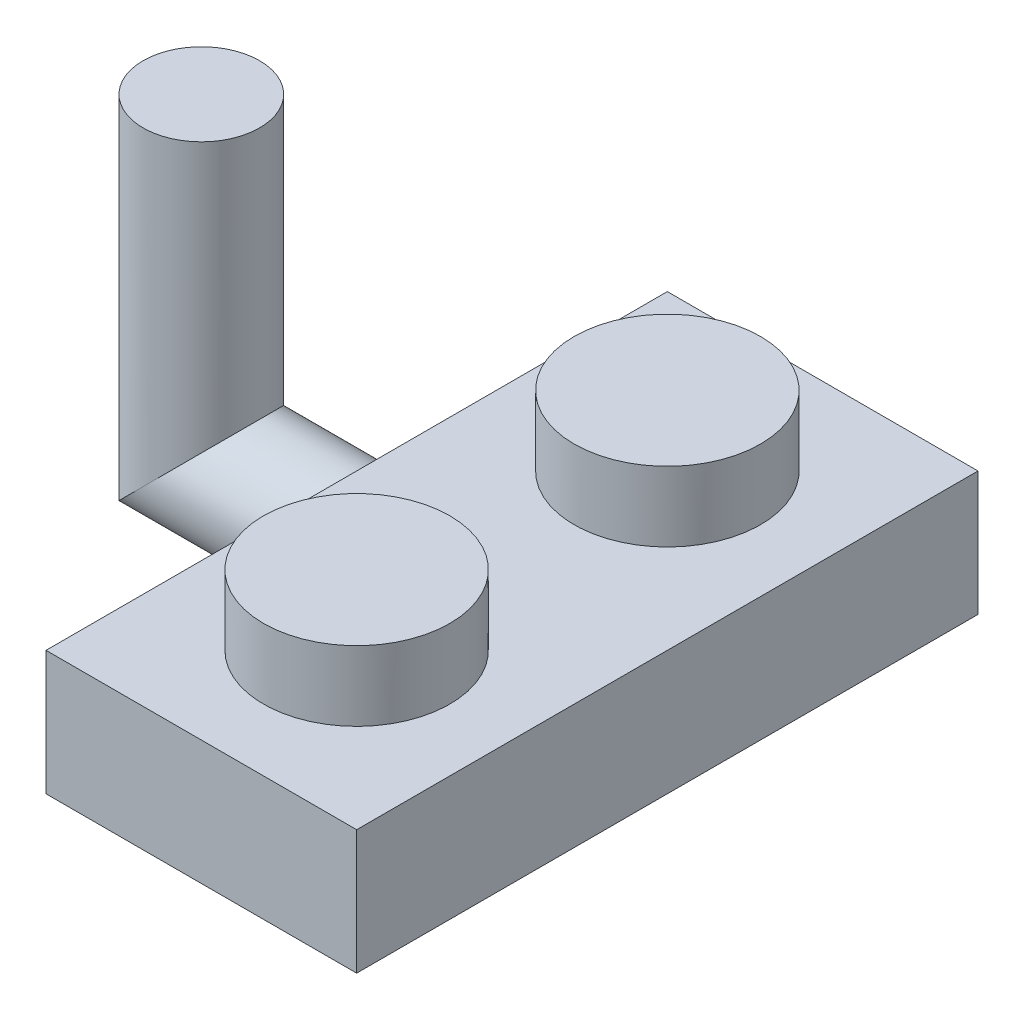
ISO-10303-21;
HEADER;
FILE_DESCRIPTION(('STEP AP214'),'2;1');
FILE_NAME('part.step','',(''),(''),'','','');
FILE_SCHEMA(('AUTOMOTIVE_DESIGN { 1 0 10303 214 1 1 1 1 }'));
ENDSEC;
DATA;
#1=APPLICATION_CONTEXT('core data for automotive mechanical design processes');
#2=APPLICATION_PROTOCOL_DEFINITION('international standard','automotive_design',2000,#1);
#3=PRODUCT_CONTEXT('',#1,'mechanical');
#4=PRODUCT('Part','Part','',(#3));
#5=PRODUCT_RELATED_PRODUCT_CATEGORY('part','',(#4));
#6=PRODUCT_DEFINITION_FORMATION('','',#4);
#7=PRODUCT_DEFINITION_CONTEXT('part definition',#1,'design');
#8=PRODUCT_DEFINITION('design','',#6,#7);
#9=PRODUCT_DEFINITION_SHAPE('','',#8);
#10=(LENGTH_UNIT() NAMED_UNIT(*) SI_UNIT(.MILLI.,.METRE.));
#11=(NAMED_UNIT(*) PLANE_ANGLE_UNIT() SI_UNIT($,.RADIAN.));
#12=(NAMED_UNIT(*) SI_UNIT($,.STERADIAN.) SOLID_ANGLE_UNIT());
#13=UNCERTAINTY_MEASURE_WITH_UNIT(LENGTH_MEASURE(1.E-05),#10,'distance_accuracy_value','');
#14=(GEOMETRIC_REPRESENTATION_CONTEXT(3) GLOBAL_UNCERTAINTY_ASSIGNED_CONTEXT((#13)) GLOBAL_UNIT_ASSIGNED_CONTEXT((#10,
#11,#12)) REPRESENTATION_CONTEXT('',''));
#15=CARTESIAN_POINT('',(0.,0.,0.));
#16=DIRECTION('',(0.,0.,1.));
#17=DIRECTION('',(1.,0.,0.));
#18=AXIS2_PLACEMENT_3D('',#15,#16,#17);
#19=CARTESIAN_POINT('',(0.,0.,16.));
#20=DIRECTION('',(1.,0.,0.));
#21=DIRECTION('',(0.,1.,0.));
#22=AXIS2_PLACEMENT_3D('',#19,#20,#21);
#23=PLANE('',#22);
#24=CARTESIAN_POINT('',(0.,1.6,8.));
#25=DIRECTION('',(1.,0.,0.));
#26=DIRECTION('',(0.,0.,-1.));
#27=AXIS2_PLACEMENT_3D('',#24,#25,#26);
#28=CIRCLE('',#27,1.5);
#29=CARTESIAN_POINT('',(0.,1.6,6.5));
#30=VERTEX_POINT('',#29);
#31=EDGE_CURVE('E242',#30,#30,#28,.T.);
#32=ORIENTED_EDGE('',*,*,#31,.T.);
#33=EDGE_LOOP('',(#32));
#34=FACE_BOUND('',#33,.T.);
#35=DIRECTION('',(0.,-1.,0.));
#36=VECTOR('',#35,1.);
#37=CARTESIAN_POINT('',(0.,0.,0.));
#38=LINE('',#37,#36);
#39=CARTESIAN_POINT('',(0.,3.2,0.));
#40=VERTEX_POINT('',#39);
#41=CARTESIAN_POINT('',(0.,0.,0.));
#42=VERTEX_POINT('',#41);
#43=EDGE_CURVE('E171',#40,#42,#38,.T.);
#44=ORIENTED_EDGE('',*,*,#43,.T.);
#45=DIRECTION('',(0.,0.,-1.));
#46=VECTOR('',#45,1.);
#47=CARTESIAN_POINT('',(0.,0.,16.));
#48=LINE('',#47,#46);
#49=CARTESIAN_POINT('',(0.,0.,16.));
#50=VERTEX_POINT('',#49);
#51=EDGE_CURVE('E208',#50,#42,#48,.T.);
#52=ORIENTED_EDGE('',*,*,#51,.F.);
#53=DIRECTION('',(0.,-1.,0.));
#54=VECTOR('',#53,1.);
#55=CARTESIAN_POINT('',(0.,0.,16.));
#56=LINE('',#55,#54);
#57=CARTESIAN_POINT('',(0.,3.2,16.));
#58=VERTEX_POINT('',#57);
#59=EDGE_CURVE('E177',#58,#50,#56,.T.);
#60=ORIENTED_EDGE('',*,*,#59,.F.);
#61=DIRECTION('',(0.,0.,-1.));
#62=VECTOR('',#61,1.);
#63=CARTESIAN_POINT('',(0.,3.2,16.));
#64=LINE('',#63,#62);
#65=EDGE_CURVE('E187',#58,#40,#64,.T.);
#66=ORIENTED_EDGE('',*,*,#65,.T.);
#67=EDGE_LOOP('',(#44,#52,#60,#66));
#68=FACE_BOUND('',#67,.T.);
#69=ADVANCED_FACE('F48',(#34,#68),#23,.F.);
#70=CARTESIAN_POINT('',(0.,0.,16.));
#71=DIRECTION('',(0.,1.,0.));
#72=DIRECTION('',(0.,0.,1.));
#73=AXIS2_PLACEMENT_3D('',#70,#71,#72);
#74=PLANE('',#73);
#75=DIRECTION('',(1.,0.,0.));
#76=VECTOR('',#75,1.);
#77=CARTESIAN_POINT('',(1.6,0.,1.6));
#78=LINE('',#77,#76);
#79=CARTESIAN_POINT('',(1.6,0.,1.6));
#80=VERTEX_POINT('',#79);
#81=CARTESIAN_POINT('',(6.4,0.,1.6));
#82=VERTEX_POINT('',#81);
#83=EDGE_CURVE('E162',#80,#82,#78,.T.);
#84=ORIENTED_EDGE('',*,*,#83,.F.);
#85=DIRECTION('',(0.,0.,-1.));
#86=VECTOR('',#85,1.);
#87=CARTESIAN_POINT('',(1.6,0.,14.4));
#88=LINE('',#87,#86);
#89=CARTESIAN_POINT('',(1.6,0.,14.4));
#90=VERTEX_POINT('',#89);
#91=EDGE_CURVE('E63',#90,#80,#88,.T.);
#92=ORIENTED_EDGE('',*,*,#91,.F.);
#93=DIRECTION('',(-1.,0.,0.));
#94=VECTOR('',#93,1.);
#95=CARTESIAN_POINT('',(1.6,0.,14.4));
#96=LINE('',#95,#94);
#97=CARTESIAN_POINT('',(6.4,0.,14.4));
#98=VERTEX_POINT('',#97);
#99=EDGE_CURVE('E146',#98,#90,#96,.T.);
#100=ORIENTED_EDGE('',*,*,#99,.F.);
#101=DIRECTION('',(0.,0.,1.));
#102=VECTOR('',#101,1.);
#103=CARTESIAN_POINT('',(6.4,0.,14.4));
#104=LINE('',#103,#102);
#105=EDGE_CURVE('E150',#82,#98,#104,.T.);
#106=ORIENTED_EDGE('',*,*,#105,.F.);
#107=EDGE_LOOP('',(#84,#92,#100,#106));
#108=FACE_BOUND('',#107,.T.);
#109=DIRECTION('',(1.,0.,0.));
#110=VECTOR('',#109,1.);
#111=CARTESIAN_POINT('',(0.,0.,0.));
#112=LINE('',#111,#110);
#113=CARTESIAN_POINT('',(8.,0.,0.));
#114=VERTEX_POINT('',#113);
#115=EDGE_CURVE('E191',#42,#114,#112,.T.);
#116=ORIENTED_EDGE('',*,*,#115,.T.);
#117=DIRECTION('',(0.,0.,-1.));
#118=VECTOR('',#117,1.);
#119=CARTESIAN_POINT('',(8.,0.,16.));
#120=LINE('',#119,#118);
#121=CARTESIAN_POINT('',(8.,0.,16.));
#122=VERTEX_POINT('',#121);
#123=EDGE_CURVE('E204',#122,#114,#120,.T.);
#124=ORIENTED_EDGE('',*,*,#123,.F.);
#125=DIRECTION('',(1.,0.,0.));
#126=VECTOR('',#125,1.);
#127=CARTESIAN_POINT('',(0.,0.,16.));
#128=LINE('',#127,#126);
#129=EDGE_CURVE('E101',#50,#122,#128,.T.);
#130=ORIENTED_EDGE('',*,*,#129,.F.);
#131=ORIENTED_EDGE('',*,*,#51,.T.);
#132=EDGE_LOOP('',(#116,#124,#130,#131));
#133=FACE_BOUND('',#132,.T.);
#134=ADVANCED_FACE('F228',(#108,#133),#74,.F.);
#135=CARTESIAN_POINT('',(8.,0.,16.));
#136=DIRECTION('',(-1.,0.,0.));
#137=DIRECTION('',(0.,-1.,0.));
#138=AXIS2_PLACEMENT_3D('',#135,#136,#137);
#139=PLANE('',#138);
#140=DIRECTION('',(0.,1.,0.));
#141=VECTOR('',#140,1.);
#142=CARTESIAN_POINT('',(8.,0.,0.));
#143=LINE('',#142,#141);
#144=CARTESIAN_POINT('',(8.,3.2,0.));
#145=VERTEX_POINT('',#144);
#146=EDGE_CURVE('E194',#114,#145,#143,.T.);
#147=ORIENTED_EDGE('',*,*,#146,.T.);
#148=DIRECTION('',(0.,0.,-1.));
#149=VECTOR('',#148,1.);
#150=CARTESIAN_POINT('',(8.,3.2,16.));
#151=LINE('',#150,#149);
#152=CARTESIAN_POINT('',(8.,3.2,16.));
#153=VERTEX_POINT('',#152);
#154=EDGE_CURVE('E201',#153,#145,#151,.T.);
#155=ORIENTED_EDGE('',*,*,#154,.F.);
#156=DIRECTION('',(0.,1.,0.));
#157=VECTOR('',#156,1.);
#158=CARTESIAN_POINT('',(8.,0.,16.));
#159=LINE('',#158,#157);
#160=EDGE_CURVE('E182',#122,#153,#159,.T.);
#161=ORIENTED_EDGE('',*,*,#160,.F.);
#162=ORIENTED_EDGE('',*,*,#123,.T.);
#163=EDGE_LOOP('',(#147,#155,#161,#162));
#164=FACE_BOUND('',#163,.T.);
#165=ADVANCED_FACE('F219',(#164),#139,.F.);
#166=CARTESIAN_POINT('',(0.,3.2,16.));
#167=DIRECTION('',(0.,-1.,0.));
#168=DIRECTION('',(0.,0.,-1.));
#169=AXIS2_PLACEMENT_3D('',#166,#167,#168);
#170=PLANE('',#169);
#171=CARTESIAN_POINT('',(4.,3.2,12.));
#172=DIRECTION('',(0.,-1.,0.));
#173=DIRECTION('',(0.,0.,-1.));
#174=AXIS2_PLACEMENT_3D('',#171,#172,#173);
#175=CIRCLE('',#174,2.4);
#176=CARTESIAN_POINT('',(4.,3.2,9.6));
#177=VERTEX_POINT('',#176);
#178=EDGE_CURVE('E12',#177,#177,#175,.F.);
#179=ORIENTED_EDGE('',*,*,#178,.F.);
#180=EDGE_LOOP('',(#179));
#181=FACE_BOUND('',#180,.T.);
#182=CARTESIAN_POINT('',(4.,3.2,4.));
#183=DIRECTION('',(0.,-1.,0.));
#184=DIRECTION('',(0.,0.,-1.));
#185=AXIS2_PLACEMENT_3D('',#182,#183,#184);
#186=CIRCLE('',#185,2.4);
#187=CARTESIAN_POINT('',(4.,3.2,1.6));
#188=VERTEX_POINT('',#187);
#189=EDGE_CURVE('E56',#188,#188,#186,.F.);
#190=ORIENTED_EDGE('',*,*,#189,.F.);
#191=EDGE_LOOP('',(#190));
#192=FACE_BOUND('',#191,.T.);
#193=DIRECTION('',(-1.,0.,0.));
#194=VECTOR('',#193,1.);
#195=CARTESIAN_POINT('',(0.,3.2,0.));
#196=LINE('',#195,#194);
#197=EDGE_CURVE('E93',#145,#40,#196,.T.);
#198=ORIENTED_EDGE('',*,*,#197,.T.);
#199=ORIENTED_EDGE('',*,*,#65,.F.);
#200=DIRECTION('',(-1.,0.,0.));
#201=VECTOR('',#200,1.);
#202=CARTESIAN_POINT('',(0.,3.2,16.));
#203=LINE('',#202,#201);
#204=EDGE_CURVE('E72',#153,#58,#203,.T.);
#205=ORIENTED_EDGE('',*,*,#204,.F.);
#206=ORIENTED_EDGE('',*,*,#154,.T.);
#207=EDGE_LOOP('',(#198,#199,#205,#206));
#208=FACE_BOUND('',#207,.T.);
#209=ADVANCED_FACE('F216',(#181,#192,#208),#170,.F.);
#210=CARTESIAN_POINT('',(0.,0.,16.));
#211=DIRECTION('',(0.,0.,-1.));
#212=DIRECTION('',(-1.,0.,0.));
#213=AXIS2_PLACEMENT_3D('',#210,#211,#212);
#214=PLANE('',#213);
#215=ORIENTED_EDGE('',*,*,#59,.T.);
#216=ORIENTED_EDGE('',*,*,#129,.T.);
#217=ORIENTED_EDGE('',*,*,#160,.T.);
#218=ORIENTED_EDGE('',*,*,#204,.T.);
#219=EDGE_LOOP('',(#215,#216,#217,#218));
#220=FACE_BOUND('',#219,.T.);
#221=ADVANCED_FACE('F218',(#220),#214,.F.);
#222=CARTESIAN_POINT('',(0.,0.,0.));
#223=DIRECTION('',(0.,0.,-1.));
#224=DIRECTION('',(-1.,0.,0.));
#225=AXIS2_PLACEMENT_3D('',#222,#223,#224);
#226=PLANE('',#225);
#227=ORIENTED_EDGE('',*,*,#43,.F.);
#228=ORIENTED_EDGE('',*,*,#197,.F.);
#229=ORIENTED_EDGE('',*,*,#146,.F.);
#230=ORIENTED_EDGE('',*,*,#115,.F.);
#231=EDGE_LOOP('',(#227,#228,#229,#230));
#232=FACE_BOUND('',#231,.T.);
#233=ADVANCED_FACE('F226',(#232),#226,.T.);
#234=CARTESIAN_POINT('',(1.6,1.8,14.4));
#235=DIRECTION('',(-1.,0.,0.));
#236=DIRECTION('',(0.,0.,1.));
#237=AXIS2_PLACEMENT_3D('',#234,#235,#236);
#238=PLANE('',#237);
#239=ORIENTED_EDGE('',*,*,#91,.T.);
#240=DIRECTION('',(0.,-1.,0.));
#241=VECTOR('',#240,1.);
#242=CARTESIAN_POINT('',(1.6,1.8,1.6));
#243=LINE('',#242,#241);
#244=CARTESIAN_POINT('',(1.6,1.8,1.6));
#245=VERTEX_POINT('',#244);
#246=EDGE_CURVE('E121',#245,#80,#243,.T.);
#247=ORIENTED_EDGE('',*,*,#246,.F.);
#248=DIRECTION('',(0.,0.,-1.));
#249=VECTOR('',#248,1.);
#250=CARTESIAN_POINT('',(1.6,1.8,14.4));
#251=LINE('',#250,#249);
#252=CARTESIAN_POINT('',(1.6,1.8,14.4));
#253=VERTEX_POINT('',#252);
#254=EDGE_CURVE('E125',#253,#245,#251,.T.);
#255=ORIENTED_EDGE('',*,*,#254,.F.);
#256=DIRECTION('',(0.,-1.,0.));
#257=VECTOR('',#256,1.);
#258=CARTESIAN_POINT('',(1.6,1.8,14.4));
#259=LINE('',#258,#257);
#260=EDGE_CURVE('E168',#253,#90,#259,.T.);
#261=ORIENTED_EDGE('',*,*,#260,.T.);
#262=EDGE_LOOP('',(#239,#247,#255,#261));
#263=FACE_BOUND('',#262,.T.);
#264=ADVANCED_FACE('F123',(#263),#238,.F.);
#265=CARTESIAN_POINT('',(1.6,1.8,14.4));
#266=DIRECTION('',(0.,0.,1.));
#267=DIRECTION('',(1.,0.,0.));
#268=AXIS2_PLACEMENT_3D('',#265,#266,#267);
#269=PLANE('',#268);
#270=ORIENTED_EDGE('',*,*,#99,.T.);
#271=ORIENTED_EDGE('',*,*,#260,.F.);
#272=DIRECTION('',(-1.,0.,0.));
#273=VECTOR('',#272,1.);
#274=CARTESIAN_POINT('',(1.6,1.8,14.4));
#275=LINE('',#274,#273);
#276=CARTESIAN_POINT('',(6.4,1.8,14.4));
#277=VERTEX_POINT('',#276);
#278=EDGE_CURVE('E132',#277,#253,#275,.T.);
#279=ORIENTED_EDGE('',*,*,#278,.F.);
#280=DIRECTION('',(0.,-1.,0.));
#281=VECTOR('',#280,1.);
#282=CARTESIAN_POINT('',(6.4,1.8,14.4));
#283=LINE('',#282,#281);
#284=EDGE_CURVE('E172',#277,#98,#283,.T.);
#285=ORIENTED_EDGE('',*,*,#284,.T.);
#286=EDGE_LOOP('',(#270,#271,#279,#285));
#287=FACE_BOUND('',#286,.T.);
#288=ADVANCED_FACE('F254',(#287),#269,.F.);
#289=CARTESIAN_POINT('',(6.4,1.8,14.4));
#290=DIRECTION('',(1.,0.,0.));
#291=DIRECTION('',(0.,0.,-1.));
#292=AXIS2_PLACEMENT_3D('',#289,#290,#291);
#293=PLANE('',#292);
#294=ORIENTED_EDGE('',*,*,#105,.T.);
#295=ORIENTED_EDGE('',*,*,#284,.F.);
#296=DIRECTION('',(0.,0.,1.));
#297=VECTOR('',#296,1.);
#298=CARTESIAN_POINT('',(6.4,1.8,14.4));
#299=LINE('',#298,#297);
#300=CARTESIAN_POINT('',(6.4,1.8,1.6));
#301=VERTEX_POINT('',#300);
#302=EDGE_CURVE('E141',#301,#277,#299,.T.);
#303=ORIENTED_EDGE('',*,*,#302,.F.);
#304=DIRECTION('',(0.,-1.,0.));
#305=VECTOR('',#304,1.);
#306=CARTESIAN_POINT('',(6.4,1.8,1.6));
#307=LINE('',#306,#305);
#308=EDGE_CURVE('E131',#301,#82,#307,.T.);
#309=ORIENTED_EDGE('',*,*,#308,.T.);
#310=EDGE_LOOP('',(#294,#295,#303,#309));
#311=FACE_BOUND('',#310,.T.);
#312=ADVANCED_FACE('F259',(#311),#293,.F.);
#313=CARTESIAN_POINT('',(1.6,1.8,1.6));
#314=DIRECTION('',(0.,0.,-1.));
#315=DIRECTION('',(-1.,0.,0.));
#316=AXIS2_PLACEMENT_3D('',#313,#314,#315);
#317=PLANE('',#316);
#318=ORIENTED_EDGE('',*,*,#83,.T.);
#319=ORIENTED_EDGE('',*,*,#308,.F.);
#320=DIRECTION('',(1.,0.,0.));
#321=VECTOR('',#320,1.);
#322=CARTESIAN_POINT('',(1.6,1.8,1.6));
#323=LINE('',#322,#321);
#324=EDGE_CURVE('E135',#245,#301,#323,.T.);
#325=ORIENTED_EDGE('',*,*,#324,.F.);
#326=ORIENTED_EDGE('',*,*,#246,.T.);
#327=EDGE_LOOP('',(#318,#319,#325,#326));
#328=FACE_BOUND('',#327,.T.);
#329=ADVANCED_FACE('F136',(#328),#317,.F.);
#330=CARTESIAN_POINT('',(0.,1.8,0.));
#331=DIRECTION('',(0.,-1.,0.));
#332=DIRECTION('',(0.,0.,-1.));
#333=AXIS2_PLACEMENT_3D('',#330,#331,#332);
#334=PLANE('',#333);
#335=CARTESIAN_POINT('',(4.,1.8,8.));
#336=DIRECTION('',(0.,-1.,0.));
#337=DIRECTION('',(0.,0.,-1.));
#338=AXIS2_PLACEMENT_3D('',#335,#336,#337);
#339=CIRCLE('',#338,1.6);
#340=CARTESIAN_POINT('',(4.,1.8,6.4));
#341=VERTEX_POINT('',#340);
#342=EDGE_CURVE('E310',#341,#341,#339,.T.);
#343=ORIENTED_EDGE('',*,*,#342,.F.);
#344=EDGE_LOOP('',(#343));
#345=FACE_BOUND('',#344,.T.);
#346=ORIENTED_EDGE('',*,*,#254,.T.);
#347=ORIENTED_EDGE('',*,*,#324,.T.);
#348=ORIENTED_EDGE('',*,*,#302,.T.);
#349=ORIENTED_EDGE('',*,*,#278,.T.);
#350=EDGE_LOOP('',(#346,#347,#348,#349));
#351=FACE_BOUND('',#350,.T.);
#352=ADVANCED_FACE('F143',(#345,#351),#334,.T.);
#353=CARTESIAN_POINT('',(4.,5.,4.));
#354=DIRECTION('',(0.,-1.,0.));
#355=DIRECTION('',(0.,0.,-1.));
#356=AXIS2_PLACEMENT_3D('',#353,#354,#355);
#357=CYLINDRICAL_SURFACE('',#356,2.4);
#358=CARTESIAN_POINT('',(4.,5.,4.));
#359=DIRECTION('',(0.,1.,0.));
#360=DIRECTION('',(0.,0.,1.));
#361=AXIS2_PLACEMENT_3D('',#358,#359,#360);
#362=CIRCLE('',#361,2.4);
#363=CARTESIAN_POINT('',(4.,5.,6.4));
#364=VERTEX_POINT('',#363);
#365=EDGE_CURVE('E153',#364,#364,#362,.T.);
#366=ORIENTED_EDGE('',*,*,#365,.F.);
#367=EDGE_LOOP('',(#366));
#368=FACE_BOUND('',#367,.T.);
#369=ORIENTED_EDGE('',*,*,#189,.T.);
#370=EDGE_LOOP('',(#369));
#371=FACE_BOUND('',#370,.T.);
#372=ADVANCED_FACE('F214',(#368,#371),#357,.T.);
#373=CARTESIAN_POINT('',(4.,5.,4.));
#374=DIRECTION('',(0.,1.,0.));
#375=DIRECTION('',(0.,0.,1.));
#376=AXIS2_PLACEMENT_3D('',#373,#374,#375);
#377=PLANE('',#376);
#378=ORIENTED_EDGE('',*,*,#365,.T.);
#379=EDGE_LOOP('',(#378));
#380=FACE_BOUND('',#379,.T.);
#381=ADVANCED_FACE('F271',(#380),#377,.T.);
#382=CARTESIAN_POINT('',(4.,5.,12.));
#383=DIRECTION('',(0.,-1.,0.));
#384=DIRECTION('',(0.,0.,-1.));
#385=AXIS2_PLACEMENT_3D('',#382,#383,#384);
#386=CYLINDRICAL_SURFACE('',#385,2.4);
#387=CARTESIAN_POINT('',(4.,5.,12.));
#388=DIRECTION('',(0.,1.,0.));
#389=DIRECTION('',(0.,0.,1.));
#390=AXIS2_PLACEMENT_3D('',#387,#388,#389);
#391=CIRCLE('',#390,2.4);
#392=CARTESIAN_POINT('',(4.,5.,14.4));
#393=VERTEX_POINT('',#392);
#394=EDGE_CURVE('E325',#393,#393,#391,.T.);
#395=ORIENTED_EDGE('',*,*,#394,.F.);
#396=EDGE_LOOP('',(#395));
#397=FACE_BOUND('',#396,.T.);
#398=ORIENTED_EDGE('',*,*,#178,.T.);
#399=EDGE_LOOP('',(#398));
#400=FACE_BOUND('',#399,.T.);
#401=ADVANCED_FACE('F275',(#397,#400),#386,.T.);
#402=CARTESIAN_POINT('',(4.,5.,12.));
#403=DIRECTION('',(0.,1.,0.));
#404=DIRECTION('',(0.,0.,1.));
#405=AXIS2_PLACEMENT_3D('',#402,#403,#404);
#406=PLANE('',#405);
#407=ORIENTED_EDGE('',*,*,#394,.T.);
#408=EDGE_LOOP('',(#407));
#409=FACE_BOUND('',#408,.T.);
#410=ADVANCED_FACE('F277',(#409),#406,.T.);
#411=CARTESIAN_POINT('',(4.,0.,8.));
#412=DIRECTION('',(0.,1.,0.));
#413=DIRECTION('',(0.,0.,1.));
#414=AXIS2_PLACEMENT_3D('',#411,#412,#413);
#415=CYLINDRICAL_SURFACE('',#414,1.6);
#416=CARTESIAN_POINT('',(4.,0.,8.));
#417=DIRECTION('',(0.,-1.,0.));
#418=DIRECTION('',(0.,0.,-1.));
#419=AXIS2_PLACEMENT_3D('',#416,#417,#418);
#420=CIRCLE('',#419,1.6);
#421=CARTESIAN_POINT('',(4.,0.,6.4));
#422=VERTEX_POINT('',#421);
#423=EDGE_CURVE('E315',#422,#422,#420,.T.);
#424=ORIENTED_EDGE('',*,*,#423,.F.);
#425=EDGE_LOOP('',(#424));
#426=FACE_BOUND('',#425,.T.);
#427=ORIENTED_EDGE('',*,*,#342,.T.);
#428=EDGE_LOOP('',(#427));
#429=FACE_BOUND('',#428,.T.);
#430=ADVANCED_FACE('F280',(#426,#429),#415,.T.);
#431=CARTESIAN_POINT('',(4.,0.,8.));
#432=DIRECTION('',(0.,-1.,0.));
#433=DIRECTION('',(0.,0.,-1.));
#434=AXIS2_PLACEMENT_3D('',#431,#432,#433);
#435=PLANE('',#434);
#436=ORIENTED_EDGE('',*,*,#423,.T.);
#437=EDGE_LOOP('',(#436));
#438=FACE_BOUND('',#437,.T.);
#439=ADVANCED_FACE('F287',(#438),#435,.T.);
#440=CARTESIAN_POINT('',(-4.,9.6,8.));
#441=DIRECTION('',(0.,-1.,0.));
#442=DIRECTION('',(0.,0.,-1.));
#443=AXIS2_PLACEMENT_3D('',#440,#441,#442);
#444=PLANE('',#443);
#445=CARTESIAN_POINT('',(-4.,9.6,8.));
#446=DIRECTION('',(0.,-1.,0.));
#447=DIRECTION('',(0.,0.,-1.));
#448=AXIS2_PLACEMENT_3D('',#445,#446,#447);
#449=CIRCLE('',#448,1.5);
#450=CARTESIAN_POINT('',(-4.,9.6,6.5));
#451=VERTEX_POINT('',#450);
#452=EDGE_CURVE('E317',#451,#451,#449,.T.);
#453=ORIENTED_EDGE('',*,*,#452,.F.);
#454=EDGE_LOOP('',(#453));
#455=FACE_BOUND('',#454,.T.);
#456=ADVANCED_FACE('F291',(#455),#444,.F.);
#457=CARTESIAN_POINT('',(-4.,-1.8,8.));
#458=DIRECTION('',(0.,1.,0.));
#459=DIRECTION('',(0.,0.,1.));
#460=AXIS2_PLACEMENT_3D('',#457,#458,#459);
#461=CYLINDRICAL_SURFACE('',#460,1.5);
#462=CARTESIAN_POINT('',(-4.,1.6,8.));
#463=DIRECTION('',(-0.707106781186548,0.707106781186548,0.));
#464=DIRECTION('',(-0.707106781186548,-0.707106781186548,0.));
#465=AXIS2_PLACEMENT_3D('',#462,#463,#464);
#466=ELLIPSE('',#465,2.12132034355964,1.5);
#467=CARTESIAN_POINT('',(-5.5,0.100000000000001,8.));
#468=VERTEX_POINT('',#467);
#469=EDGE_CURVE('E308',#468,#468,#466,.T.);
#470=ORIENTED_EDGE('',*,*,#469,.T.);
#471=EDGE_LOOP('',(#470));
#472=FACE_BOUND('',#471,.T.);
#473=ORIENTED_EDGE('',*,*,#452,.T.);
#474=EDGE_LOOP('',(#473));
#475=FACE_BOUND('',#474,.T.);
#476=ADVANCED_FACE('F296',(#472,#475),#461,.T.);
#477=CARTESIAN_POINT('',(0.,1.6,8.));
#478=DIRECTION('',(-1.,0.,0.));
#479=DIRECTION('',(0.,-1.,0.));
#480=AXIS2_PLACEMENT_3D('',#477,#478,#479);
#481=CYLINDRICAL_SURFACE('',#480,1.5);
#482=ORIENTED_EDGE('',*,*,#31,.F.);
#483=EDGE_LOOP('',(#482));
#484=FACE_BOUND('',#483,.T.);
#485=ORIENTED_EDGE('',*,*,#469,.F.);
#486=EDGE_LOOP('',(#485));
#487=FACE_BOUND('',#486,.T.);
#488=ADVANCED_FACE('F293',(#484,#487),#481,.T.);
#489=CLOSED_SHELL('',(#69,#134,#165,#209,#221,#233,#264,#288,#312,#329,#352,#372,#381,#401,#410,
#430,#439,#456,#476,#488));
#490=MANIFOLD_SOLID_BREP('B2',#489);
#491=ADVANCED_BREP_SHAPE_REPRESENTATION('',(#18,#490),#14);
#492=SHAPE_DEFINITION_REPRESENTATION(#9,#491);
ENDSEC;
END-ISO-10303-21;
